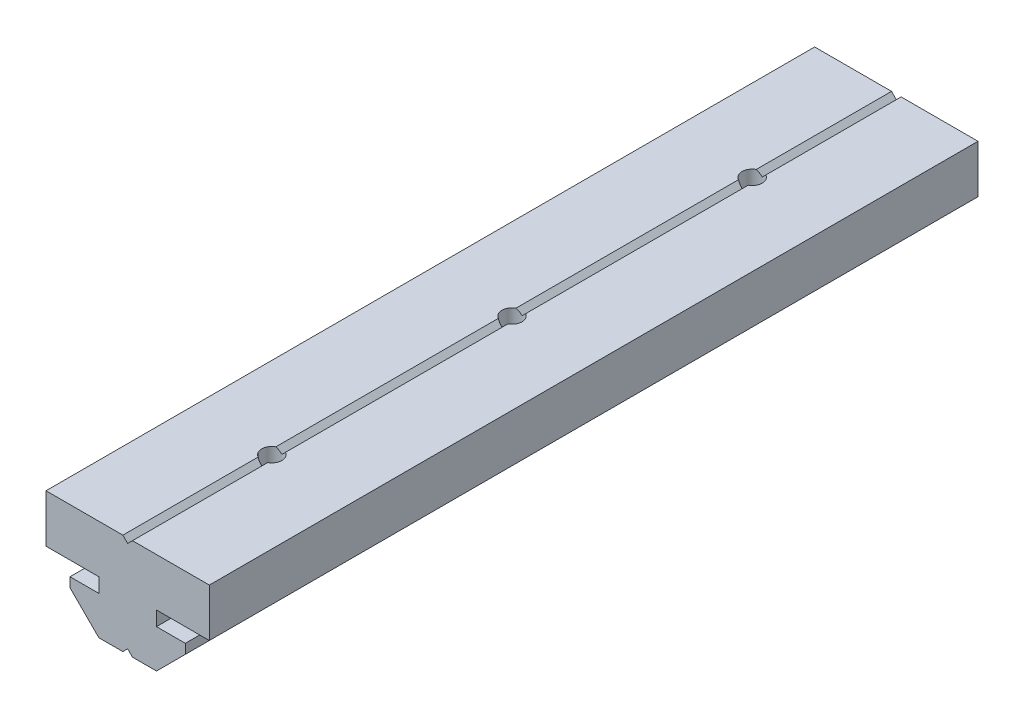
ISO-10303-21;
HEADER;
FILE_DESCRIPTION(('STEP AP214'),'2;1');
FILE_NAME('part.step','',(''),(''),'','','');
FILE_SCHEMA(('AUTOMOTIVE_DESIGN { 1 0 10303 214 1 1 1 1 }'));
ENDSEC;
DATA;
#1=APPLICATION_CONTEXT('core data for automotive mechanical design processes');
#2=APPLICATION_PROTOCOL_DEFINITION('international standard','automotive_design',2000,#1);
#3=PRODUCT_CONTEXT('',#1,'mechanical');
#4=PRODUCT('Part','Part','',(#3));
#5=PRODUCT_RELATED_PRODUCT_CATEGORY('part','',(#4));
#6=PRODUCT_DEFINITION_FORMATION('','',#4);
#7=PRODUCT_DEFINITION_CONTEXT('part definition',#1,'design');
#8=PRODUCT_DEFINITION('design','',#6,#7);
#9=PRODUCT_DEFINITION_SHAPE('','',#8);
#10=(LENGTH_UNIT() NAMED_UNIT(*) SI_UNIT(.MILLI.,.METRE.));
#11=(NAMED_UNIT(*) PLANE_ANGLE_UNIT() SI_UNIT($,.RADIAN.));
#12=(NAMED_UNIT(*) SI_UNIT($,.STERADIAN.) SOLID_ANGLE_UNIT());
#13=UNCERTAINTY_MEASURE_WITH_UNIT(LENGTH_MEASURE(1.E-05),#10,'distance_accuracy_value','');
#14=(GEOMETRIC_REPRESENTATION_CONTEXT(3) GLOBAL_UNCERTAINTY_ASSIGNED_CONTEXT((#13)) GLOBAL_UNIT_ASSIGNED_CONTEXT((#10,
#11,#12)) REPRESENTATION_CONTEXT('',''));
#15=CARTESIAN_POINT('',(0.,0.,0.));
#16=DIRECTION('',(0.,0.,1.));
#17=DIRECTION('',(1.,0.,0.));
#18=AXIS2_PLACEMENT_3D('',#15,#16,#17);
#19=CARTESIAN_POINT('',(-0.500000000000002,0.,80.));
#20=DIRECTION('',(-0.707106781186546,0.707106781186549,0.));
#21=DIRECTION('',(-0.707106781186549,-0.707106781186546,0.));
#22=AXIS2_PLACEMENT_3D('',#19,#20,#21);
#23=PLANE('',#22);
#24=DIRECTION('',(0.,0.,-1.));
#25=VECTOR('',#24,1.);
#26=CARTESIAN_POINT('',(0.,0.5,80.));
#27=LINE('',#26,#25);
#28=CARTESIAN_POINT('',(0.,0.5,13.95));
#29=VERTEX_POINT('',#28);
#30=CARTESIAN_POINT('',(0.,0.5,0.));
#31=VERTEX_POINT('',#30);
#32=EDGE_CURVE('E307',#29,#31,#27,.T.);
#33=ORIENTED_EDGE('',*,*,#32,.F.);
#34=CARTESIAN_POINT('',(0.,0.500000000000002,15.));
#35=DIRECTION('',(-0.707106781186546,0.707106781186549,0.));
#36=DIRECTION('',(0.707106781186549,0.707106781186546,0.));
#37=AXIS2_PLACEMENT_3D('',#34,#35,#36);
#38=ELLIPSE('',#37,1.48492424049175,1.05);
#39=CARTESIAN_POINT('',(-0.500000000000003,0.,14.076690734369));
#40=VERTEX_POINT('',#39);
#41=EDGE_CURVE('E293',#29,#40,#38,.T.);
#42=ORIENTED_EDGE('',*,*,#41,.T.);
#43=DIRECTION('',(0.,0.,-1.));
#44=VECTOR('',#43,1.);
#45=CARTESIAN_POINT('',(-0.500000000000002,0.,80.));
#46=LINE('',#45,#44);
#47=CARTESIAN_POINT('',(-0.500000000000002,0.,0.));
#48=VERTEX_POINT('',#47);
#49=EDGE_CURVE('E312',#40,#48,#46,.T.);
#50=ORIENTED_EDGE('',*,*,#49,.T.);
#51=DIRECTION('',(0.707106781186549,0.707106781186546,0.));
#52=VECTOR('',#51,1.);
#53=CARTESIAN_POINT('',(-0.500000000000002,0.,0.));
#54=LINE('',#53,#52);
#55=EDGE_CURVE('E487',#48,#31,#54,.T.);
#56=ORIENTED_EDGE('',*,*,#55,.T.);
#57=EDGE_LOOP('',(#33,#42,#50,#56));
#58=FACE_BOUND('',#57,.T.);
#59=ADVANCED_FACE('F32',(#58),#23,.F.);
#60=CARTESIAN_POINT('',(0.,10.,80.));
#61=DIRECTION('',(-0.707106781186549,-0.707106781186546,0.));
#62=DIRECTION('',(0.707106781186546,-0.707106781186549,0.));
#63=AXIS2_PLACEMENT_3D('',#60,#61,#62);
#64=PLANE('',#63);
#65=DIRECTION('',(0.,0.,-1.));
#66=VECTOR('',#65,1.);
#67=CARTESIAN_POINT('',(-0.499999999999999,10.5,80.));
#68=LINE('',#67,#66);
#69=CARTESIAN_POINT('',(-0.499999999999999,10.5,14.076690734369));
#70=VERTEX_POINT('',#69);
#71=CARTESIAN_POINT('',(-0.499999999999999,10.5,0.));
#72=VERTEX_POINT('',#71);
#73=EDGE_CURVE('E339',#70,#72,#68,.T.);
#74=ORIENTED_EDGE('',*,*,#73,.F.);
#75=CARTESIAN_POINT('',(0.,10.,15.));
#76=DIRECTION('',(-0.707106781186549,-0.707106781186546,0.));
#77=DIRECTION('',(-0.707106781186546,0.707106781186549,0.));
#78=AXIS2_PLACEMENT_3D('',#75,#76,#77);
#79=ELLIPSE('',#78,1.48492424049176,1.05);
#80=CARTESIAN_POINT('',(0.,10.,13.95));
#81=VERTEX_POINT('',#80);
#82=EDGE_CURVE('E55',#70,#81,#79,.T.);
#83=ORIENTED_EDGE('',*,*,#82,.T.);
#84=DIRECTION('',(0.,0.,-1.));
#85=VECTOR('',#84,1.);
#86=CARTESIAN_POINT('',(0.,10.,80.));
#87=LINE('',#86,#85);
#88=CARTESIAN_POINT('',(0.,10.,0.));
#89=VERTEX_POINT('',#88);
#90=EDGE_CURVE('E346',#81,#89,#87,.T.);
#91=ORIENTED_EDGE('',*,*,#90,.T.);
#92=DIRECTION('',(-0.707106781186546,0.707106781186549,0.));
#93=VECTOR('',#92,1.);
#94=CARTESIAN_POINT('',(0.,10.,0.));
#95=LINE('',#94,#93);
#96=EDGE_CURVE('E414',#89,#72,#95,.T.);
#97=ORIENTED_EDGE('',*,*,#96,.T.);
#98=EDGE_LOOP('',(#74,#83,#91,#97));
#99=FACE_BOUND('',#98,.T.);
#100=ADVANCED_FACE('F673',(#99),#64,.F.);
#101=CARTESIAN_POINT('',(0.500000000000002,0.,80.));
#102=DIRECTION('',(0.707106781186546,0.707106781186549,0.));
#103=DIRECTION('',(-0.707106781186549,0.707106781186546,0.));
#104=AXIS2_PLACEMENT_3D('',#101,#102,#103);
#105=PLANE('',#104);
#106=CARTESIAN_POINT('',(0.,0.5,38.95));
#107=VERTEX_POINT('',#106);
#108=CARTESIAN_POINT('',(0.,0.5,16.05));
#109=VERTEX_POINT('',#108);
#110=EDGE_CURVE('E291',#107,#109,#27,.T.);
#111=ORIENTED_EDGE('',*,*,#110,.T.);
#112=CARTESIAN_POINT('',(0.,0.499999999999997,15.));
#113=DIRECTION('',(0.707106781186546,0.707106781186549,0.));
#114=DIRECTION('',(-0.707106781186549,0.707106781186546,0.));
#115=AXIS2_PLACEMENT_3D('',#112,#113,#114);
#116=ELLIPSE('',#115,1.48492424049175,1.05);
#117=CARTESIAN_POINT('',(0.500000000000002,0.,15.923309265631));
#118=VERTEX_POINT('',#117);
#119=EDGE_CURVE('E276',#109,#118,#116,.T.);
#120=ORIENTED_EDGE('',*,*,#119,.T.);
#121=DIRECTION('',(0.,0.,-1.));
#122=VECTOR('',#121,1.);
#123=CARTESIAN_POINT('',(0.500000000000002,0.,80.));
#124=LINE('',#123,#122);
#125=CARTESIAN_POINT('',(0.500000000000002,0.,39.076690734369));
#126=VERTEX_POINT('',#125);
#127=EDGE_CURVE('E289',#126,#118,#124,.T.);
#128=ORIENTED_EDGE('',*,*,#127,.F.);
#129=CARTESIAN_POINT('',(0.,0.499999999999993,40.));
#130=DIRECTION('',(0.707106781186546,0.707106781186549,0.));
#131=DIRECTION('',(-0.707106781186549,0.707106781186546,0.));
#132=AXIS2_PLACEMENT_3D('',#129,#130,#131);
#133=ELLIPSE('',#132,1.48492424049175,1.05);
#134=EDGE_CURVE('E631',#126,#107,#133,.T.);
#135=ORIENTED_EDGE('',*,*,#134,.T.);
#136=EDGE_LOOP('',(#111,#120,#128,#135));
#137=FACE_BOUND('',#136,.T.);
#138=ADVANCED_FACE('F287',(#137),#105,.F.);
#139=CARTESIAN_POINT('',(0.,10.,80.));
#140=DIRECTION('',(0.707106781186549,-0.707106781186546,0.));
#141=DIRECTION('',(0.707106781186546,0.707106781186549,0.));
#142=AXIS2_PLACEMENT_3D('',#139,#140,#141);
#143=PLANE('',#142);
#144=DIRECTION('',(0.,0.,-1.));
#145=VECTOR('',#144,1.);
#146=CARTESIAN_POINT('',(0.499999999999999,10.5,80.));
#147=LINE('',#146,#145);
#148=CARTESIAN_POINT('',(0.499999999999999,10.5,39.076690734369));
#149=VERTEX_POINT('',#148);
#150=CARTESIAN_POINT('',(0.499999999999999,10.5,15.923309265631));
#151=VERTEX_POINT('',#150);
#152=EDGE_CURVE('E719',#149,#151,#147,.T.);
#153=ORIENTED_EDGE('',*,*,#152,.T.);
#154=CARTESIAN_POINT('',(0.,10.,15.));
#155=DIRECTION('',(0.707106781186549,-0.707106781186546,0.));
#156=DIRECTION('',(0.707106781186546,0.707106781186549,0.));
#157=AXIS2_PLACEMENT_3D('',#154,#155,#156);
#158=ELLIPSE('',#157,1.48492424049176,1.05);
#159=CARTESIAN_POINT('',(0.,10.,16.05));
#160=VERTEX_POINT('',#159);
#161=EDGE_CURVE('E646',#151,#160,#158,.T.);
#162=ORIENTED_EDGE('',*,*,#161,.T.);
#163=CARTESIAN_POINT('',(0.,10.,38.95));
#164=VERTEX_POINT('',#163);
#165=EDGE_CURVE('E715',#164,#160,#87,.T.);
#166=ORIENTED_EDGE('',*,*,#165,.F.);
#167=CARTESIAN_POINT('',(0.,10.,40.));
#168=DIRECTION('',(0.707106781186549,-0.707106781186546,0.));
#169=DIRECTION('',(0.707106781186546,0.707106781186549,0.));
#170=AXIS2_PLACEMENT_3D('',#167,#168,#169);
#171=ELLIPSE('',#170,1.48492424049176,1.05);
#172=EDGE_CURVE('E636',#164,#149,#171,.T.);
#173=ORIENTED_EDGE('',*,*,#172,.T.);
#174=EDGE_LOOP('',(#153,#162,#166,#173));
#175=FACE_BOUND('',#174,.T.);
#176=ADVANCED_FACE('F681',(#175),#143,.F.);
#177=CARTESIAN_POINT('',(-0.500000000000003,0.,39.076690734369));
#178=VERTEX_POINT('',#177);
#179=CARTESIAN_POINT('',(-0.500000000000003,0.,15.923309265631));
#180=VERTEX_POINT('',#179);
#181=EDGE_CURVE('E654',#178,#180,#46,.T.);
#182=ORIENTED_EDGE('',*,*,#181,.T.);
#183=EDGE_CURVE('E292',#180,#109,#38,.T.);
#184=ORIENTED_EDGE('',*,*,#183,.T.);
#185=ORIENTED_EDGE('',*,*,#110,.F.);
#186=CARTESIAN_POINT('',(0.,0.500000000000007,40.));
#187=DIRECTION('',(-0.707106781186546,0.707106781186549,0.));
#188=DIRECTION('',(0.707106781186549,0.707106781186546,0.));
#189=AXIS2_PLACEMENT_3D('',#186,#187,#188);
#190=ELLIPSE('',#189,1.48492424049175,1.05);
#191=EDGE_CURVE('E628',#107,#178,#190,.T.);
#192=ORIENTED_EDGE('',*,*,#191,.T.);
#193=EDGE_LOOP('',(#182,#184,#185,#192));
#194=FACE_BOUND('',#193,.T.);
#195=ADVANCED_FACE('F656',(#194),#23,.F.);
#196=ORIENTED_EDGE('',*,*,#165,.T.);
#197=CARTESIAN_POINT('',(-0.499999999999998,10.5,15.923309265631));
#198=VERTEX_POINT('',#197);
#199=EDGE_CURVE('E338',#160,#198,#79,.T.);
#200=ORIENTED_EDGE('',*,*,#199,.T.);
#201=CARTESIAN_POINT('',(-0.499999999999999,10.5,39.076690734369));
#202=VERTEX_POINT('',#201);
#203=EDGE_CURVE('E326',#202,#198,#68,.T.);
#204=ORIENTED_EDGE('',*,*,#203,.F.);
#205=CARTESIAN_POINT('',(0.,9.99999999999999,40.));
#206=DIRECTION('',(-0.707106781186549,-0.707106781186546,0.));
#207=DIRECTION('',(-0.707106781186546,0.707106781186549,0.));
#208=AXIS2_PLACEMENT_3D('',#205,#206,#207);
#209=ELLIPSE('',#208,1.48492424049176,1.05);
#210=EDGE_CURVE('E336',#202,#164,#209,.T.);
#211=ORIENTED_EDGE('',*,*,#210,.T.);
#212=EDGE_LOOP('',(#196,#200,#204,#211));
#213=FACE_BOUND('',#212,.T.);
#214=ADVANCED_FACE('F335',(#213),#64,.F.);
#215=CARTESIAN_POINT('',(0.,0.5,63.95));
#216=VERTEX_POINT('',#215);
#217=CARTESIAN_POINT('',(0.,0.5,41.05));
#218=VERTEX_POINT('',#217);
#219=EDGE_CURVE('E313',#216,#218,#27,.T.);
#220=ORIENTED_EDGE('',*,*,#219,.T.);
#221=CARTESIAN_POINT('',(0.500000000000003,0.,40.923309265631));
#222=VERTEX_POINT('',#221);
#223=EDGE_CURVE('E626',#218,#222,#133,.T.);
#224=ORIENTED_EDGE('',*,*,#223,.T.);
#225=CARTESIAN_POINT('',(0.500000000000002,0.,64.076690734369));
#226=VERTEX_POINT('',#225);
#227=EDGE_CURVE('E299',#226,#222,#124,.T.);
#228=ORIENTED_EDGE('',*,*,#227,.F.);
#229=CARTESIAN_POINT('',(0.,0.49999999999999,65.));
#230=DIRECTION('',(0.707106781186546,0.707106781186549,0.));
#231=DIRECTION('',(-0.707106781186549,0.707106781186546,0.));
#232=AXIS2_PLACEMENT_3D('',#229,#230,#231);
#233=ELLIPSE('',#232,1.48492424049174,1.05);
#234=EDGE_CURVE('E574',#226,#216,#233,.T.);
#235=ORIENTED_EDGE('',*,*,#234,.T.);
#236=EDGE_LOOP('',(#220,#224,#228,#235));
#237=FACE_BOUND('',#236,.T.);
#238=ADVANCED_FACE('F660',(#237),#105,.F.);
#239=CARTESIAN_POINT('',(0.499999999999999,10.5,64.076690734369));
#240=VERTEX_POINT('',#239);
#241=CARTESIAN_POINT('',(0.499999999999999,10.5,40.923309265631));
#242=VERTEX_POINT('',#241);
#243=EDGE_CURVE('E357',#240,#242,#147,.T.);
#244=ORIENTED_EDGE('',*,*,#243,.T.);
#245=CARTESIAN_POINT('',(0.,10.,41.05));
#246=VERTEX_POINT('',#245);
#247=EDGE_CURVE('E635',#242,#246,#171,.T.);
#248=ORIENTED_EDGE('',*,*,#247,.T.);
#249=CARTESIAN_POINT('',(0.,10.,63.95));
#250=VERTEX_POINT('',#249);
#251=EDGE_CURVE('E352',#250,#246,#87,.T.);
#252=ORIENTED_EDGE('',*,*,#251,.F.);
#253=CARTESIAN_POINT('',(0.,10.,65.));
#254=DIRECTION('',(0.707106781186549,-0.707106781186546,0.));
#255=DIRECTION('',(0.707106781186546,0.707106781186549,0.));
#256=AXIS2_PLACEMENT_3D('',#253,#254,#255);
#257=ELLIPSE('',#256,1.48492424049175,1.05);
#258=EDGE_CURVE('E565',#250,#240,#257,.T.);
#259=ORIENTED_EDGE('',*,*,#258,.T.);
#260=EDGE_LOOP('',(#244,#248,#252,#259));
#261=FACE_BOUND('',#260,.T.);
#262=ADVANCED_FACE('F689',(#261),#143,.F.);
#263=CARTESIAN_POINT('',(-0.500000000000002,0.,64.076690734369));
#264=VERTEX_POINT('',#263);
#265=CARTESIAN_POINT('',(-0.500000000000003,0.,40.923309265631));
#266=VERTEX_POINT('',#265);
#267=EDGE_CURVE('E318',#264,#266,#46,.T.);
#268=ORIENTED_EDGE('',*,*,#267,.T.);
#269=EDGE_CURVE('E624',#266,#218,#190,.T.);
#270=ORIENTED_EDGE('',*,*,#269,.T.);
#271=ORIENTED_EDGE('',*,*,#219,.F.);
#272=CARTESIAN_POINT('',(0.,0.50000000000001,65.));
#273=DIRECTION('',(-0.707106781186546,0.707106781186549,0.));
#274=DIRECTION('',(0.707106781186549,0.707106781186546,0.));
#275=AXIS2_PLACEMENT_3D('',#272,#273,#274);
#276=ELLIPSE('',#275,1.48492424049174,1.05);
#277=EDGE_CURVE('E579',#216,#264,#276,.T.);
#278=ORIENTED_EDGE('',*,*,#277,.T.);
#279=EDGE_LOOP('',(#268,#270,#271,#278));
#280=FACE_BOUND('',#279,.T.);
#281=ADVANCED_FACE('F661',(#280),#23,.F.);
#282=CARTESIAN_POINT('',(0.,0.5,80.));
#283=VERTEX_POINT('',#282);
#284=CARTESIAN_POINT('',(0.,0.5,66.05));
#285=VERTEX_POINT('',#284);
#286=EDGE_CURVE('E309',#283,#285,#27,.T.);
#287=ORIENTED_EDGE('',*,*,#286,.T.);
#288=CARTESIAN_POINT('',(0.500000000000001,0.,65.923309265631));
#289=VERTEX_POINT('',#288);
#290=EDGE_CURVE('E581',#285,#289,#233,.T.);
#291=ORIENTED_EDGE('',*,*,#290,.T.);
#292=CARTESIAN_POINT('',(0.500000000000002,0.,80.));
#293=VERTEX_POINT('',#292);
#294=EDGE_CURVE('E302',#293,#289,#124,.T.);
#295=ORIENTED_EDGE('',*,*,#294,.F.);
#296=DIRECTION('',(0.707106781186549,-0.707106781186546,0.));
#297=VECTOR('',#296,1.);
#298=CARTESIAN_POINT('',(0.500000000000002,0.,80.));
#299=LINE('',#298,#297);
#300=EDGE_CURVE('E526',#283,#293,#299,.T.);
#301=ORIENTED_EDGE('',*,*,#300,.F.);
#302=EDGE_LOOP('',(#287,#291,#295,#301));
#303=FACE_BOUND('',#302,.T.);
#304=ADVANCED_FACE('F589',(#303),#105,.F.);
#305=CARTESIAN_POINT('',(0.499999999999999,10.5,80.));
#306=VERTEX_POINT('',#305);
#307=CARTESIAN_POINT('',(0.499999999999999,10.5,65.923309265631));
#308=VERTEX_POINT('',#307);
#309=EDGE_CURVE('E353',#306,#308,#147,.T.);
#310=ORIENTED_EDGE('',*,*,#309,.T.);
#311=CARTESIAN_POINT('',(0.,10.,66.05));
#312=VERTEX_POINT('',#311);
#313=EDGE_CURVE('E560',#308,#312,#257,.T.);
#314=ORIENTED_EDGE('',*,*,#313,.T.);
#315=CARTESIAN_POINT('',(0.,10.,80.));
#316=VERTEX_POINT('',#315);
#317=EDGE_CURVE('E348',#316,#312,#87,.T.);
#318=ORIENTED_EDGE('',*,*,#317,.F.);
#319=DIRECTION('',(-0.707106781186546,-0.707106781186549,0.));
#320=VECTOR('',#319,1.);
#321=CARTESIAN_POINT('',(0.,10.,80.));
#322=LINE('',#321,#320);
#323=EDGE_CURVE('E546',#306,#316,#322,.T.);
#324=ORIENTED_EDGE('',*,*,#323,.F.);
#325=EDGE_LOOP('',(#310,#314,#318,#324));
#326=FACE_BOUND('',#325,.T.);
#327=ADVANCED_FACE('F622',(#326),#143,.F.);
#328=ORIENTED_EDGE('',*,*,#251,.T.);
#329=CARTESIAN_POINT('',(-0.500000000000001,10.5,40.923309265631));
#330=VERTEX_POINT('',#329);
#331=EDGE_CURVE('E633',#246,#330,#209,.T.);
#332=ORIENTED_EDGE('',*,*,#331,.T.);
#333=CARTESIAN_POINT('',(-0.499999999999999,10.5,64.076690734369));
#334=VERTEX_POINT('',#333);
#335=EDGE_CURVE('E328',#334,#330,#68,.T.);
#336=ORIENTED_EDGE('',*,*,#335,.F.);
#337=CARTESIAN_POINT('',(0.,9.99999999999999,65.));
#338=DIRECTION('',(-0.707106781186549,-0.707106781186546,0.));
#339=DIRECTION('',(-0.707106781186546,0.707106781186549,0.));
#340=AXIS2_PLACEMENT_3D('',#337,#338,#339);
#341=ELLIPSE('',#340,1.48492424049175,1.05);
#342=EDGE_CURVE('E563',#334,#250,#341,.T.);
#343=ORIENTED_EDGE('',*,*,#342,.T.);
#344=EDGE_LOOP('',(#328,#332,#336,#343));
#345=FACE_BOUND('',#344,.T.);
#346=ADVANCED_FACE('F687',(#345),#64,.F.);
#347=CARTESIAN_POINT('',(-3.00000000000001,0.,80.));
#348=DIRECTION('',(0.,1.,0.));
#349=DIRECTION('',(-1.,0.,0.));
#350=AXIS2_PLACEMENT_3D('',#347,#348,#349);
#351=PLANE('',#350);
#352=ORIENTED_EDGE('',*,*,#49,.F.);
#353=CARTESIAN_POINT('',(0.,0.,15.));
#354=DIRECTION('',(0.,1.,0.));
#355=DIRECTION('',(0.,0.,1.));
#356=AXIS2_PLACEMENT_3D('',#353,#354,#355);
#357=CIRCLE('',#356,1.05);
#358=EDGE_CURVE('E282',#40,#180,#357,.T.);
#359=ORIENTED_EDGE('',*,*,#358,.T.);
#360=ORIENTED_EDGE('',*,*,#181,.F.);
#361=CARTESIAN_POINT('',(0.,0.,40.));
#362=DIRECTION('',(0.,1.,0.));
#363=DIRECTION('',(0.,0.,1.));
#364=AXIS2_PLACEMENT_3D('',#361,#362,#363);
#365=CIRCLE('',#364,1.05);
#366=EDGE_CURVE('E641',#178,#266,#365,.T.);
#367=ORIENTED_EDGE('',*,*,#366,.T.);
#368=ORIENTED_EDGE('',*,*,#267,.F.);
#369=CARTESIAN_POINT('',(0.,0.,65.));
#370=DIRECTION('',(0.,1.,0.));
#371=DIRECTION('',(0.,0.,1.));
#372=AXIS2_PLACEMENT_3D('',#369,#370,#371);
#373=CIRCLE('',#372,1.05);
#374=CARTESIAN_POINT('',(-0.500000000000002,0.,65.923309265631));
#375=VERTEX_POINT('',#374);
#376=EDGE_CURVE('E521',#264,#375,#373,.T.);
#377=ORIENTED_EDGE('',*,*,#376,.T.);
#378=CARTESIAN_POINT('',(-0.500000000000002,0.,80.));
#379=VERTEX_POINT('',#378);
#380=EDGE_CURVE('E314',#379,#375,#46,.T.);
#381=ORIENTED_EDGE('',*,*,#380,.F.);
#382=DIRECTION('',(1.,0.,0.));
#383=VECTOR('',#382,1.);
#384=CARTESIAN_POINT('',(-3.00000000000001,0.,80.));
#385=LINE('',#384,#383);
#386=CARTESIAN_POINT('',(-3.00000000000001,0.,80.));
#387=VERTEX_POINT('',#386);
#388=EDGE_CURVE('E431',#387,#379,#385,.T.);
#389=ORIENTED_EDGE('',*,*,#388,.F.);
#390=DIRECTION('',(0.,0.,-1.));
#391=VECTOR('',#390,1.);
#392=CARTESIAN_POINT('',(-3.00000000000001,0.,80.));
#393=LINE('',#392,#391);
#394=CARTESIAN_POINT('',(-3.00000000000001,0.,0.));
#395=VERTEX_POINT('',#394);
#396=EDGE_CURVE('E432',#387,#395,#393,.T.);
#397=ORIENTED_EDGE('',*,*,#396,.T.);
#398=DIRECTION('',(1.,0.,0.));
#399=VECTOR('',#398,1.);
#400=CARTESIAN_POINT('',(-3.00000000000001,0.,0.));
#401=LINE('',#400,#399);
#402=EDGE_CURVE('E484',#395,#48,#401,.T.);
#403=ORIENTED_EDGE('',*,*,#402,.T.);
#404=EDGE_LOOP('',(#352,#359,#360,#367,#368,#377,#381,#389,#397,#403));
#405=FACE_BOUND('',#404,.T.);
#406=ADVANCED_FACE('F34',(#405),#351,.F.);
#407=ORIENTED_EDGE('',*,*,#380,.T.);
#408=EDGE_CURVE('E488',#375,#285,#276,.T.);
#409=ORIENTED_EDGE('',*,*,#408,.T.);
#410=ORIENTED_EDGE('',*,*,#286,.F.);
#411=DIRECTION('',(0.707106781186549,0.707106781186546,0.));
#412=VECTOR('',#411,1.);
#413=CARTESIAN_POINT('',(-0.500000000000002,0.,80.));
#414=LINE('',#413,#412);
#415=EDGE_CURVE('E516',#379,#283,#414,.T.);
#416=ORIENTED_EDGE('',*,*,#415,.F.);
#417=EDGE_LOOP('',(#407,#409,#410,#416));
#418=FACE_BOUND('',#417,.T.);
#419=ADVANCED_FACE('F524',(#418),#23,.F.);
#420=CARTESIAN_POINT('',(0.500000000000002,0.,14.076690734369));
#421=VERTEX_POINT('',#420);
#422=CARTESIAN_POINT('',(0.500000000000002,0.,0.));
#423=VERTEX_POINT('',#422);
#424=EDGE_CURVE('E300',#421,#423,#124,.T.);
#425=ORIENTED_EDGE('',*,*,#424,.F.);
#426=EDGE_CURVE('E47',#421,#29,#116,.T.);
#427=ORIENTED_EDGE('',*,*,#426,.T.);
#428=ORIENTED_EDGE('',*,*,#32,.T.);
#429=DIRECTION('',(0.707106781186549,-0.707106781186546,0.));
#430=VECTOR('',#429,1.);
#431=CARTESIAN_POINT('',(0.500000000000002,0.,0.));
#432=LINE('',#431,#430);
#433=EDGE_CURVE('E397',#31,#423,#432,.T.);
#434=ORIENTED_EDGE('',*,*,#433,.T.);
#435=EDGE_LOOP('',(#425,#427,#428,#434));
#436=FACE_BOUND('',#435,.T.);
#437=ADVANCED_FACE('F492',(#436),#105,.F.);
#438=CARTESIAN_POINT('',(3.00000000000001,0.,80.));
#439=DIRECTION('',(0.,1.,0.));
#440=DIRECTION('',(-1.,0.,0.));
#441=AXIS2_PLACEMENT_3D('',#438,#439,#440);
#442=PLANE('',#441);
#443=ORIENTED_EDGE('',*,*,#127,.T.);
#444=EDGE_CURVE('E273',#118,#421,#357,.T.);
#445=ORIENTED_EDGE('',*,*,#444,.T.);
#446=ORIENTED_EDGE('',*,*,#424,.T.);
#447=DIRECTION('',(1.,0.,0.));
#448=VECTOR('',#447,1.);
#449=CARTESIAN_POINT('',(3.00000000000001,0.,0.));
#450=LINE('',#449,#448);
#451=CARTESIAN_POINT('',(3.00000000000001,0.,0.));
#452=VERTEX_POINT('',#451);
#453=EDGE_CURVE('E391',#423,#452,#450,.T.);
#454=ORIENTED_EDGE('',*,*,#453,.T.);
#455=DIRECTION('',(0.,0.,-1.));
#456=VECTOR('',#455,1.);
#457=CARTESIAN_POINT('',(3.00000000000001,0.,80.));
#458=LINE('',#457,#456);
#459=CARTESIAN_POINT('',(3.00000000000001,0.,80.));
#460=VERTEX_POINT('',#459);
#461=EDGE_CURVE('E303',#460,#452,#458,.T.);
#462=ORIENTED_EDGE('',*,*,#461,.F.);
#463=DIRECTION('',(1.,0.,0.));
#464=VECTOR('',#463,1.);
#465=CARTESIAN_POINT('',(3.00000000000001,0.,80.));
#466=LINE('',#465,#464);
#467=EDGE_CURVE('E528',#293,#460,#466,.T.);
#468=ORIENTED_EDGE('',*,*,#467,.F.);
#469=ORIENTED_EDGE('',*,*,#294,.T.);
#470=EDGE_CURVE('E561',#289,#226,#373,.T.);
#471=ORIENTED_EDGE('',*,*,#470,.T.);
#472=ORIENTED_EDGE('',*,*,#227,.T.);
#473=EDGE_CURVE('E298',#222,#126,#365,.T.);
#474=ORIENTED_EDGE('',*,*,#473,.T.);
#475=EDGE_LOOP('',(#443,#445,#446,#454,#462,#468,#469,#471,#472,#474));
#476=FACE_BOUND('',#475,.T.);
#477=ADVANCED_FACE('F296',(#476),#442,.F.);
#478=CARTESIAN_POINT('',(6.,3.,80.));
#479=DIRECTION('',(-0.707106781186549,0.707106781186546,0.));
#480=DIRECTION('',(-0.707106781186546,-0.707106781186549,0.));
#481=AXIS2_PLACEMENT_3D('',#478,#479,#480);
#482=PLANE('',#481);
#483=DIRECTION('',(0.707106781186546,0.707106781186549,0.));
#484=VECTOR('',#483,1.);
#485=CARTESIAN_POINT('',(6.,3.,0.));
#486=LINE('',#485,#484);
#487=CARTESIAN_POINT('',(6.,3.,0.));
#488=VERTEX_POINT('',#487);
#489=EDGE_CURVE('E383',#452,#488,#486,.T.);
#490=ORIENTED_EDGE('',*,*,#489,.T.);
#491=DIRECTION('',(0.,0.,-1.));
#492=VECTOR('',#491,1.);
#493=CARTESIAN_POINT('',(6.,3.,80.));
#494=LINE('',#493,#492);
#495=CARTESIAN_POINT('',(6.,3.,80.));
#496=VERTEX_POINT('',#495);
#497=EDGE_CURVE('E371',#496,#488,#494,.T.);
#498=ORIENTED_EDGE('',*,*,#497,.F.);
#499=DIRECTION('',(0.707106781186546,0.707106781186549,0.));
#500=VECTOR('',#499,1.);
#501=CARTESIAN_POINT('',(6.,3.,80.));
#502=LINE('',#501,#500);
#503=EDGE_CURVE('E384',#460,#496,#502,.T.);
#504=ORIENTED_EDGE('',*,*,#503,.F.);
#505=ORIENTED_EDGE('',*,*,#461,.T.);
#506=EDGE_LOOP('',(#490,#498,#504,#505));
#507=FACE_BOUND('',#506,.T.);
#508=ADVANCED_FACE('F382',(#507),#482,.F.);
#509=CARTESIAN_POINT('',(6.,4.,80.));
#510=DIRECTION('',(-1.,0.,0.));
#511=DIRECTION('',(0.,0.,1.));
#512=AXIS2_PLACEMENT_3D('',#509,#510,#511);
#513=PLANE('',#512);
#514=DIRECTION('',(0.,1.,0.));
#515=VECTOR('',#514,1.);
#516=CARTESIAN_POINT('',(6.,4.,0.));
#517=LINE('',#516,#515);
#518=CARTESIAN_POINT('',(6.,4.,0.));
#519=VERTEX_POINT('',#518);
#520=EDGE_CURVE('E393',#488,#519,#517,.T.);
#521=ORIENTED_EDGE('',*,*,#520,.T.);
#522=DIRECTION('',(0.,0.,-1.));
#523=VECTOR('',#522,1.);
#524=CARTESIAN_POINT('',(6.,4.,80.));
#525=LINE('',#524,#523);
#526=CARTESIAN_POINT('',(6.,4.,80.));
#527=VERTEX_POINT('',#526);
#528=EDGE_CURVE('E369',#527,#519,#525,.T.);
#529=ORIENTED_EDGE('',*,*,#528,.F.);
#530=DIRECTION('',(0.,1.,0.));
#531=VECTOR('',#530,1.);
#532=CARTESIAN_POINT('',(6.,4.,80.));
#533=LINE('',#532,#531);
#534=EDGE_CURVE('E534',#496,#527,#533,.T.);
#535=ORIENTED_EDGE('',*,*,#534,.F.);
#536=ORIENTED_EDGE('',*,*,#497,.T.);
#537=EDGE_LOOP('',(#521,#529,#535,#536));
#538=FACE_BOUND('',#537,.T.);
#539=ADVANCED_FACE('F593',(#538),#513,.F.);
#540=CARTESIAN_POINT('',(3.,4.,80.));
#541=DIRECTION('',(0.,-1.,0.));
#542=DIRECTION('',(0.,0.,-1.));
#543=AXIS2_PLACEMENT_3D('',#540,#541,#542);
#544=PLANE('',#543);
#545=DIRECTION('',(-1.,0.,0.));
#546=VECTOR('',#545,1.);
#547=CARTESIAN_POINT('',(3.,4.,0.));
#548=LINE('',#547,#546);
#549=CARTESIAN_POINT('',(3.,4.,0.));
#550=VERTEX_POINT('',#549);
#551=EDGE_CURVE('E395',#519,#550,#548,.T.);
#552=ORIENTED_EDGE('',*,*,#551,.T.);
#553=DIRECTION('',(0.,0.,-1.));
#554=VECTOR('',#553,1.);
#555=CARTESIAN_POINT('',(3.,4.,80.));
#556=LINE('',#555,#554);
#557=CARTESIAN_POINT('',(3.,4.,80.));
#558=VERTEX_POINT('',#557);
#559=EDGE_CURVE('E366',#558,#550,#556,.T.);
#560=ORIENTED_EDGE('',*,*,#559,.F.);
#561=DIRECTION('',(-1.,0.,0.));
#562=VECTOR('',#561,1.);
#563=CARTESIAN_POINT('',(3.,4.,80.));
#564=LINE('',#563,#562);
#565=EDGE_CURVE('E536',#527,#558,#564,.T.);
#566=ORIENTED_EDGE('',*,*,#565,.F.);
#567=ORIENTED_EDGE('',*,*,#528,.T.);
#568=EDGE_LOOP('',(#552,#560,#566,#567));
#569=FACE_BOUND('',#568,.T.);
#570=ADVANCED_FACE('F597',(#569),#544,.F.);
#571=CARTESIAN_POINT('',(3.,5.5,80.));
#572=DIRECTION('',(-1.,0.,0.));
#573=DIRECTION('',(0.,-1.,0.));
#574=AXIS2_PLACEMENT_3D('',#571,#572,#573);
#575=PLANE('',#574);
#576=DIRECTION('',(0.,1.,0.));
#577=VECTOR('',#576,1.);
#578=CARTESIAN_POINT('',(3.,5.5,0.));
#579=LINE('',#578,#577);
#580=CARTESIAN_POINT('',(3.,5.5,0.));
#581=VERTEX_POINT('',#580);
#582=EDGE_CURVE('E402',#550,#581,#579,.T.);
#583=ORIENTED_EDGE('',*,*,#582,.T.);
#584=DIRECTION('',(0.,0.,-1.));
#585=VECTOR('',#584,1.);
#586=CARTESIAN_POINT('',(3.,5.5,80.));
#587=LINE('',#586,#585);
#588=CARTESIAN_POINT('',(3.,5.5,80.));
#589=VERTEX_POINT('',#588);
#590=EDGE_CURVE('E363',#589,#581,#587,.T.);
#591=ORIENTED_EDGE('',*,*,#590,.F.);
#592=DIRECTION('',(0.,1.,0.));
#593=VECTOR('',#592,1.);
#594=CARTESIAN_POINT('',(3.,5.5,80.));
#595=LINE('',#594,#593);
#596=EDGE_CURVE('E538',#558,#589,#595,.T.);
#597=ORIENTED_EDGE('',*,*,#596,.F.);
#598=ORIENTED_EDGE('',*,*,#559,.T.);
#599=EDGE_LOOP('',(#583,#591,#597,#598));
#600=FACE_BOUND('',#599,.T.);
#601=ADVANCED_FACE('F603',(#600),#575,.F.);
#602=CARTESIAN_POINT('',(8.5,5.5,80.));
#603=DIRECTION('',(0.,1.,0.));
#604=DIRECTION('',(-1.,0.,0.));
#605=AXIS2_PLACEMENT_3D('',#602,#603,#604);
#606=PLANE('',#605);
#607=DIRECTION('',(1.,0.,0.));
#608=VECTOR('',#607,1.);
#609=CARTESIAN_POINT('',(8.5,5.5,0.));
#610=LINE('',#609,#608);
#611=CARTESIAN_POINT('',(8.5,5.5,0.));
#612=VERTEX_POINT('',#611);
#613=EDGE_CURVE('E404',#581,#612,#610,.T.);
#614=ORIENTED_EDGE('',*,*,#613,.T.);
#615=DIRECTION('',(0.,0.,-1.));
#616=VECTOR('',#615,1.);
#617=CARTESIAN_POINT('',(8.5,5.5,80.));
#618=LINE('',#617,#616);
#619=CARTESIAN_POINT('',(8.5,5.5,80.));
#620=VERTEX_POINT('',#619);
#621=EDGE_CURVE('E360',#620,#612,#618,.T.);
#622=ORIENTED_EDGE('',*,*,#621,.F.);
#623=DIRECTION('',(1.,0.,0.));
#624=VECTOR('',#623,1.);
#625=CARTESIAN_POINT('',(8.5,5.5,80.));
#626=LINE('',#625,#624);
#627=EDGE_CURVE('E540',#589,#620,#626,.T.);
#628=ORIENTED_EDGE('',*,*,#627,.F.);
#629=ORIENTED_EDGE('',*,*,#590,.T.);
#630=EDGE_LOOP('',(#614,#622,#628,#629));
#631=FACE_BOUND('',#630,.T.);
#632=ADVANCED_FACE('F607',(#631),#606,.F.);
#633=CARTESIAN_POINT('',(8.5,10.5,80.));
#634=DIRECTION('',(-1.,0.,0.));
#635=DIRECTION('',(0.,0.,1.));
#636=AXIS2_PLACEMENT_3D('',#633,#634,#635);
#637=PLANE('',#636);
#638=DIRECTION('',(0.,1.,0.));
#639=VECTOR('',#638,1.);
#640=CARTESIAN_POINT('',(8.5,10.5,0.));
#641=LINE('',#640,#639);
#642=CARTESIAN_POINT('',(8.5,10.5,0.));
#643=VERTEX_POINT('',#642);
#644=EDGE_CURVE('E406',#612,#643,#641,.T.);
#645=ORIENTED_EDGE('',*,*,#644,.T.);
#646=DIRECTION('',(0.,0.,-1.));
#647=VECTOR('',#646,1.);
#648=CARTESIAN_POINT('',(8.5,10.5,80.));
#649=LINE('',#648,#647);
#650=CARTESIAN_POINT('',(8.5,10.5,80.));
#651=VERTEX_POINT('',#650);
#652=EDGE_CURVE('E356',#651,#643,#649,.T.);
#653=ORIENTED_EDGE('',*,*,#652,.F.);
#654=DIRECTION('',(0.,1.,0.));
#655=VECTOR('',#654,1.);
#656=CARTESIAN_POINT('',(8.5,10.5,80.));
#657=LINE('',#656,#655);
#658=EDGE_CURVE('E542',#620,#651,#657,.T.);
#659=ORIENTED_EDGE('',*,*,#658,.F.);
#660=ORIENTED_EDGE('',*,*,#621,.T.);
#661=EDGE_LOOP('',(#645,#653,#659,#660));
#662=FACE_BOUND('',#661,.T.);
#663=ADVANCED_FACE('F612',(#662),#637,.F.);
#664=CARTESIAN_POINT('',(0.499999999999999,10.5,80.));
#665=DIRECTION('',(0.,-1.,0.));
#666=DIRECTION('',(1.,0.,0.));
#667=AXIS2_PLACEMENT_3D('',#664,#665,#666);
#668=PLANE('',#667);
#669=CARTESIAN_POINT('',(0.499999999999999,10.5,14.076690734369));
#670=VERTEX_POINT('',#669);
#671=CARTESIAN_POINT('',(0.499999999999999,10.5,0.));
#672=VERTEX_POINT('',#671);
#673=EDGE_CURVE('E351',#670,#672,#147,.T.);
#674=ORIENTED_EDGE('',*,*,#673,.F.);
#675=CARTESIAN_POINT('',(0.,10.5,15.));
#676=DIRECTION('',(0.,1.,0.));
#677=DIRECTION('',(0.,0.,1.));
#678=AXIS2_PLACEMENT_3D('',#675,#676,#677);
#679=CIRCLE('',#678,1.05);
#680=EDGE_CURVE('E649',#151,#670,#679,.T.);
#681=ORIENTED_EDGE('',*,*,#680,.F.);
#682=ORIENTED_EDGE('',*,*,#152,.F.);
#683=CARTESIAN_POINT('',(0.,10.5,40.));
#684=DIRECTION('',(0.,1.,0.));
#685=DIRECTION('',(0.,0.,1.));
#686=AXIS2_PLACEMENT_3D('',#683,#684,#685);
#687=CIRCLE('',#686,1.05);
#688=EDGE_CURVE('E639',#242,#149,#687,.T.);
#689=ORIENTED_EDGE('',*,*,#688,.F.);
#690=ORIENTED_EDGE('',*,*,#243,.F.);
#691=CARTESIAN_POINT('',(0.,10.5,65.));
#692=DIRECTION('',(0.,1.,0.));
#693=DIRECTION('',(0.,0.,1.));
#694=AXIS2_PLACEMENT_3D('',#691,#692,#693);
#695=CIRCLE('',#694,1.05);
#696=EDGE_CURVE('E620',#308,#240,#695,.T.);
#697=ORIENTED_EDGE('',*,*,#696,.F.);
#698=ORIENTED_EDGE('',*,*,#309,.F.);
#699=DIRECTION('',(-1.,0.,0.));
#700=VECTOR('',#699,1.);
#701=CARTESIAN_POINT('',(0.499999999999999,10.5,80.));
#702=LINE('',#701,#700);
#703=EDGE_CURVE('E544',#651,#306,#702,.T.);
#704=ORIENTED_EDGE('',*,*,#703,.F.);
#705=ORIENTED_EDGE('',*,*,#652,.T.);
#706=DIRECTION('',(-1.,0.,0.));
#707=VECTOR('',#706,1.);
#708=CARTESIAN_POINT('',(0.499999999999999,10.5,0.));
#709=LINE('',#708,#707);
#710=EDGE_CURVE('E408',#643,#672,#709,.T.);
#711=ORIENTED_EDGE('',*,*,#710,.T.);
#712=EDGE_LOOP('',(#674,#681,#682,#689,#690,#697,#698,#704,#705,#711));
#713=FACE_BOUND('',#712,.T.);
#714=ADVANCED_FACE('F619',(#713),#668,.F.);
#715=ORIENTED_EDGE('',*,*,#90,.F.);
#716=EDGE_CURVE('E281',#81,#670,#158,.T.);
#717=ORIENTED_EDGE('',*,*,#716,.T.);
#718=ORIENTED_EDGE('',*,*,#673,.T.);
#719=DIRECTION('',(-0.707106781186546,-0.707106781186549,0.));
#720=VECTOR('',#719,1.);
#721=CARTESIAN_POINT('',(0.,10.,0.));
#722=LINE('',#721,#720);
#723=EDGE_CURVE('E411',#672,#89,#722,.T.);
#724=ORIENTED_EDGE('',*,*,#723,.T.);
#725=EDGE_LOOP('',(#715,#717,#718,#724));
#726=FACE_BOUND('',#725,.T.);
#727=ADVANCED_FACE('F698',(#726),#143,.F.);
#728=ORIENTED_EDGE('',*,*,#317,.T.);
#729=CARTESIAN_POINT('',(-0.500000000000001,10.5,65.923309265631));
#730=VERTEX_POINT('',#729);
#731=EDGE_CURVE('E556',#312,#730,#341,.T.);
#732=ORIENTED_EDGE('',*,*,#731,.T.);
#733=CARTESIAN_POINT('',(-0.499999999999999,10.5,80.));
#734=VERTEX_POINT('',#733);
#735=EDGE_CURVE('E341',#734,#730,#68,.T.);
#736=ORIENTED_EDGE('',*,*,#735,.F.);
#737=DIRECTION('',(-0.707106781186546,0.707106781186549,0.));
#738=VECTOR('',#737,1.);
#739=CARTESIAN_POINT('',(0.,10.,80.));
#740=LINE('',#739,#738);
#741=EDGE_CURVE('E548',#316,#734,#740,.T.);
#742=ORIENTED_EDGE('',*,*,#741,.F.);
#743=EDGE_LOOP('',(#728,#732,#736,#742));
#744=FACE_BOUND('',#743,.T.);
#745=ADVANCED_FACE('F555',(#744),#64,.F.);
#746=CARTESIAN_POINT('',(-0.499999999999999,10.5,80.));
#747=DIRECTION('',(0.,-1.,0.));
#748=DIRECTION('',(1.,0.,0.));
#749=AXIS2_PLACEMENT_3D('',#746,#747,#748);
#750=PLANE('',#749);
#751=ORIENTED_EDGE('',*,*,#203,.T.);
#752=CARTESIAN_POINT('',(0.,10.5,15.));
#753=DIRECTION('',(0.,-1.,0.));
#754=DIRECTION('',(1.,0.,0.));
#755=AXIS2_PLACEMENT_3D('',#752,#753,#754);
#756=CIRCLE('',#755,1.05);
#757=EDGE_CURVE('E11',#198,#70,#756,.T.);
#758=ORIENTED_EDGE('',*,*,#757,.T.);
#759=ORIENTED_EDGE('',*,*,#73,.T.);
#760=DIRECTION('',(-1.,0.,0.));
#761=VECTOR('',#760,1.);
#762=CARTESIAN_POINT('',(-0.499999999999999,10.5,0.));
#763=LINE('',#762,#761);
#764=CARTESIAN_POINT('',(-8.5,10.5,0.));
#765=VERTEX_POINT('',#764);
#766=EDGE_CURVE('E417',#72,#765,#763,.T.);
#767=ORIENTED_EDGE('',*,*,#766,.T.);
#768=DIRECTION('',(0.,0.,-1.));
#769=VECTOR('',#768,1.);
#770=CARTESIAN_POINT('',(-8.5,10.5,80.));
#771=LINE('',#770,#769);
#772=CARTESIAN_POINT('',(-8.5,10.5,80.));
#773=VERTEX_POINT('',#772);
#774=EDGE_CURVE('E342',#773,#765,#771,.T.);
#775=ORIENTED_EDGE('',*,*,#774,.F.);
#776=DIRECTION('',(-1.,0.,0.));
#777=VECTOR('',#776,1.);
#778=CARTESIAN_POINT('',(-0.499999999999999,10.5,80.));
#779=LINE('',#778,#777);
#780=EDGE_CURVE('E550',#734,#773,#779,.T.);
#781=ORIENTED_EDGE('',*,*,#780,.F.);
#782=ORIENTED_EDGE('',*,*,#735,.T.);
#783=CARTESIAN_POINT('',(0.,10.5,65.));
#784=DIRECTION('',(0.,-1.,0.));
#785=DIRECTION('',(1.,0.,0.));
#786=AXIS2_PLACEMENT_3D('',#783,#784,#785);
#787=CIRCLE('',#786,1.05);
#788=EDGE_CURVE('E317',#730,#334,#787,.T.);
#789=ORIENTED_EDGE('',*,*,#788,.T.);
#790=ORIENTED_EDGE('',*,*,#335,.T.);
#791=CARTESIAN_POINT('',(0.,10.5,40.));
#792=DIRECTION('',(0.,-1.,0.));
#793=DIRECTION('',(1.,0.,0.));
#794=AXIS2_PLACEMENT_3D('',#791,#792,#793);
#795=CIRCLE('',#794,1.05);
#796=EDGE_CURVE('E40',#330,#202,#795,.T.);
#797=ORIENTED_EDGE('',*,*,#796,.T.);
#798=EDGE_LOOP('',(#751,#758,#759,#767,#775,#781,#782,#789,#790,#797));
#799=FACE_BOUND('',#798,.T.);
#800=ADVANCED_FACE('F325',(#799),#750,.F.);
#801=CARTESIAN_POINT('',(-8.5,10.5,80.));
#802=DIRECTION('',(1.,0.,0.));
#803=DIRECTION('',(0.,0.,-1.));
#804=AXIS2_PLACEMENT_3D('',#801,#802,#803);
#805=PLANE('',#804);
#806=DIRECTION('',(0.,-1.,0.));
#807=VECTOR('',#806,1.);
#808=CARTESIAN_POINT('',(-8.5,10.5,0.));
#809=LINE('',#808,#807);
#810=CARTESIAN_POINT('',(-8.5,5.5,0.));
#811=VERTEX_POINT('',#810);
#812=EDGE_CURVE('E419',#765,#811,#809,.T.);
#813=ORIENTED_EDGE('',*,*,#812,.T.);
#814=DIRECTION('',(0.,0.,-1.));
#815=VECTOR('',#814,1.);
#816=CARTESIAN_POINT('',(-8.5,5.5,80.));
#817=LINE('',#816,#815);
#818=CARTESIAN_POINT('',(-8.5,5.5,80.));
#819=VERTEX_POINT('',#818);
#820=EDGE_CURVE('E447',#819,#811,#817,.T.);
#821=ORIENTED_EDGE('',*,*,#820,.F.);
#822=DIRECTION('',(0.,-1.,0.));
#823=VECTOR('',#822,1.);
#824=CARTESIAN_POINT('',(-8.5,10.5,80.));
#825=LINE('',#824,#823);
#826=EDGE_CURVE('E459',#773,#819,#825,.T.);
#827=ORIENTED_EDGE('',*,*,#826,.F.);
#828=ORIENTED_EDGE('',*,*,#774,.T.);
#829=EDGE_LOOP('',(#813,#821,#827,#828));
#830=FACE_BOUND('',#829,.T.);
#831=ADVANCED_FACE('F458',(#830),#805,.F.);
#832=CARTESIAN_POINT('',(-8.5,5.5,80.));
#833=DIRECTION('',(0.,1.,0.));
#834=DIRECTION('',(-1.,0.,0.));
#835=AXIS2_PLACEMENT_3D('',#832,#833,#834);
#836=PLANE('',#835);
#837=DIRECTION('',(1.,0.,0.));
#838=VECTOR('',#837,1.);
#839=CARTESIAN_POINT('',(-8.5,5.5,0.));
#840=LINE('',#839,#838);
#841=CARTESIAN_POINT('',(-3.,5.5,0.));
#842=VERTEX_POINT('',#841);
#843=EDGE_CURVE('E421',#811,#842,#840,.T.);
#844=ORIENTED_EDGE('',*,*,#843,.T.);
#845=DIRECTION('',(0.,0.,-1.));
#846=VECTOR('',#845,1.);
#847=CARTESIAN_POINT('',(-3.,5.5,80.));
#848=LINE('',#847,#846);
#849=CARTESIAN_POINT('',(-3.,5.5,80.));
#850=VERTEX_POINT('',#849);
#851=EDGE_CURVE('E445',#850,#842,#848,.T.);
#852=ORIENTED_EDGE('',*,*,#851,.F.);
#853=DIRECTION('',(1.,0.,0.));
#854=VECTOR('',#853,1.);
#855=CARTESIAN_POINT('',(-8.5,5.5,80.));
#856=LINE('',#855,#854);
#857=EDGE_CURVE('E475',#819,#850,#856,.T.);
#858=ORIENTED_EDGE('',*,*,#857,.F.);
#859=ORIENTED_EDGE('',*,*,#820,.T.);
#860=EDGE_LOOP('',(#844,#852,#858,#859));
#861=FACE_BOUND('',#860,.T.);
#862=ADVANCED_FACE('F466',(#861),#836,.F.);
#863=CARTESIAN_POINT('',(-3.,5.5,80.));
#864=DIRECTION('',(1.,0.,0.));
#865=DIRECTION('',(0.,1.,0.));
#866=AXIS2_PLACEMENT_3D('',#863,#864,#865);
#867=PLANE('',#866);
#868=DIRECTION('',(0.,-1.,0.));
#869=VECTOR('',#868,1.);
#870=CARTESIAN_POINT('',(-3.,5.5,0.));
#871=LINE('',#870,#869);
#872=CARTESIAN_POINT('',(-3.,4.,0.));
#873=VERTEX_POINT('',#872);
#874=EDGE_CURVE('E423',#842,#873,#871,.T.);
#875=ORIENTED_EDGE('',*,*,#874,.T.);
#876=DIRECTION('',(0.,0.,-1.));
#877=VECTOR('',#876,1.);
#878=CARTESIAN_POINT('',(-3.,4.,80.));
#879=LINE('',#878,#877);
#880=CARTESIAN_POINT('',(-3.,4.,80.));
#881=VERTEX_POINT('',#880);
#882=EDGE_CURVE('E442',#881,#873,#879,.T.);
#883=ORIENTED_EDGE('',*,*,#882,.F.);
#884=DIRECTION('',(0.,-1.,0.));
#885=VECTOR('',#884,1.);
#886=CARTESIAN_POINT('',(-3.,5.5,80.));
#887=LINE('',#886,#885);
#888=EDGE_CURVE('E471',#850,#881,#887,.T.);
#889=ORIENTED_EDGE('',*,*,#888,.F.);
#890=ORIENTED_EDGE('',*,*,#851,.T.);
#891=EDGE_LOOP('',(#875,#883,#889,#890));
#892=FACE_BOUND('',#891,.T.);
#893=ADVANCED_FACE('F469',(#892),#867,.F.);
#894=CARTESIAN_POINT('',(-3.,4.,80.));
#895=DIRECTION('',(0.,-1.,0.));
#896=DIRECTION('',(0.,0.,-1.));
#897=AXIS2_PLACEMENT_3D('',#894,#895,#896);
#898=PLANE('',#897);
#899=DIRECTION('',(-1.,0.,0.));
#900=VECTOR('',#899,1.);
#901=CARTESIAN_POINT('',(-3.,4.,0.));
#902=LINE('',#901,#900);
#903=CARTESIAN_POINT('',(-6.,4.,0.));
#904=VERTEX_POINT('',#903);
#905=EDGE_CURVE('E425',#873,#904,#902,.T.);
#906=ORIENTED_EDGE('',*,*,#905,.T.);
#907=DIRECTION('',(0.,0.,-1.));
#908=VECTOR('',#907,1.);
#909=CARTESIAN_POINT('',(-6.,4.,80.));
#910=LINE('',#909,#908);
#911=CARTESIAN_POINT('',(-6.,4.,80.));
#912=VERTEX_POINT('',#911);
#913=EDGE_CURVE('E439',#912,#904,#910,.T.);
#914=ORIENTED_EDGE('',*,*,#913,.F.);
#915=DIRECTION('',(-1.,0.,0.));
#916=VECTOR('',#915,1.);
#917=CARTESIAN_POINT('',(-3.,4.,80.));
#918=LINE('',#917,#916);
#919=EDGE_CURVE('E474',#881,#912,#918,.T.);
#920=ORIENTED_EDGE('',*,*,#919,.F.);
#921=ORIENTED_EDGE('',*,*,#882,.T.);
#922=EDGE_LOOP('',(#906,#914,#920,#921));
#923=FACE_BOUND('',#922,.T.);
#924=ADVANCED_FACE('F514',(#923),#898,.F.);
#925=CARTESIAN_POINT('',(-6.,4.,80.));
#926=DIRECTION('',(1.,0.,0.));
#927=DIRECTION('',(0.,0.,-1.));
#928=AXIS2_PLACEMENT_3D('',#925,#926,#927);
#929=PLANE('',#928);
#930=DIRECTION('',(0.,-1.,0.));
#931=VECTOR('',#930,1.);
#932=CARTESIAN_POINT('',(-6.,4.,0.));
#933=LINE('',#932,#931);
#934=CARTESIAN_POINT('',(-6.,3.,0.));
#935=VERTEX_POINT('',#934);
#936=EDGE_CURVE('E427',#904,#935,#933,.T.);
#937=ORIENTED_EDGE('',*,*,#936,.T.);
#938=DIRECTION('',(0.,0.,-1.));
#939=VECTOR('',#938,1.);
#940=CARTESIAN_POINT('',(-6.,3.,80.));
#941=LINE('',#940,#939);
#942=CARTESIAN_POINT('',(-6.,3.,80.));
#943=VERTEX_POINT('',#942);
#944=EDGE_CURVE('E435',#943,#935,#941,.T.);
#945=ORIENTED_EDGE('',*,*,#944,.F.);
#946=DIRECTION('',(0.,-1.,0.));
#947=VECTOR('',#946,1.);
#948=CARTESIAN_POINT('',(-6.,4.,80.));
#949=LINE('',#948,#947);
#950=EDGE_CURVE('E477',#912,#943,#949,.T.);
#951=ORIENTED_EDGE('',*,*,#950,.F.);
#952=ORIENTED_EDGE('',*,*,#913,.T.);
#953=EDGE_LOOP('',(#937,#945,#951,#952));
#954=FACE_BOUND('',#953,.T.);
#955=ADVANCED_FACE('F510',(#954),#929,.F.);
#956=CARTESIAN_POINT('',(-6.,3.,80.));
#957=DIRECTION('',(0.707106781186549,0.707106781186546,0.));
#958=DIRECTION('',(-0.707106781186546,0.707106781186549,0.));
#959=AXIS2_PLACEMENT_3D('',#956,#957,#958);
#960=PLANE('',#959);
#961=DIRECTION('',(0.707106781186546,-0.707106781186549,0.));
#962=VECTOR('',#961,1.);
#963=CARTESIAN_POINT('',(-6.,3.,0.));
#964=LINE('',#963,#962);
#965=EDGE_CURVE('E429',#935,#395,#964,.T.);
#966=ORIENTED_EDGE('',*,*,#965,.T.);
#967=ORIENTED_EDGE('',*,*,#396,.F.);
#968=DIRECTION('',(0.707106781186546,-0.707106781186549,0.));
#969=VECTOR('',#968,1.);
#970=CARTESIAN_POINT('',(-6.,3.,80.));
#971=LINE('',#970,#969);
#972=EDGE_CURVE('E436',#943,#387,#971,.T.);
#973=ORIENTED_EDGE('',*,*,#972,.F.);
#974=ORIENTED_EDGE('',*,*,#944,.T.);
#975=EDGE_LOOP('',(#966,#967,#973,#974));
#976=FACE_BOUND('',#975,.T.);
#977=ADVANCED_FACE('F506',(#976),#960,.F.);
#978=CARTESIAN_POINT('',(0.,0.,80.));
#979=DIRECTION('',(0.,0.,-1.));
#980=DIRECTION('',(-1.,0.,0.));
#981=AXIS2_PLACEMENT_3D('',#978,#979,#980);
#982=PLANE('',#981);
#983=ORIENTED_EDGE('',*,*,#388,.T.);
#984=ORIENTED_EDGE('',*,*,#415,.T.);
#985=ORIENTED_EDGE('',*,*,#300,.T.);
#986=ORIENTED_EDGE('',*,*,#467,.T.);
#987=ORIENTED_EDGE('',*,*,#503,.T.);
#988=ORIENTED_EDGE('',*,*,#534,.T.);
#989=ORIENTED_EDGE('',*,*,#565,.T.);
#990=ORIENTED_EDGE('',*,*,#596,.T.);
#991=ORIENTED_EDGE('',*,*,#627,.T.);
#992=ORIENTED_EDGE('',*,*,#658,.T.);
#993=ORIENTED_EDGE('',*,*,#703,.T.);
#994=ORIENTED_EDGE('',*,*,#323,.T.);
#995=ORIENTED_EDGE('',*,*,#741,.T.);
#996=ORIENTED_EDGE('',*,*,#780,.T.);
#997=ORIENTED_EDGE('',*,*,#826,.T.);
#998=ORIENTED_EDGE('',*,*,#857,.T.);
#999=ORIENTED_EDGE('',*,*,#888,.T.);
#1000=ORIENTED_EDGE('',*,*,#919,.T.);
#1001=ORIENTED_EDGE('',*,*,#950,.T.);
#1002=ORIENTED_EDGE('',*,*,#972,.T.);
#1003=EDGE_LOOP('',(#983,#984,#985,#986,#987,#988,#989,#990,#991,#992,#993,#994,#995,#996,#997,
#998,#999,#1000,#1001,#1002));
#1004=FACE_BOUND('',#1003,.T.);
#1005=ADVANCED_FACE('F515',(#1004),#982,.F.);
#1006=CARTESIAN_POINT('',(0.,0.,0.));
#1007=DIRECTION('',(0.,0.,-1.));
#1008=DIRECTION('',(-1.,0.,0.));
#1009=AXIS2_PLACEMENT_3D('',#1006,#1007,#1008);
#1010=PLANE('',#1009);
#1011=ORIENTED_EDGE('',*,*,#402,.F.);
#1012=ORIENTED_EDGE('',*,*,#965,.F.);
#1013=ORIENTED_EDGE('',*,*,#936,.F.);
#1014=ORIENTED_EDGE('',*,*,#905,.F.);
#1015=ORIENTED_EDGE('',*,*,#874,.F.);
#1016=ORIENTED_EDGE('',*,*,#843,.F.);
#1017=ORIENTED_EDGE('',*,*,#812,.F.);
#1018=ORIENTED_EDGE('',*,*,#766,.F.);
#1019=ORIENTED_EDGE('',*,*,#96,.F.);
#1020=ORIENTED_EDGE('',*,*,#723,.F.);
#1021=ORIENTED_EDGE('',*,*,#710,.F.);
#1022=ORIENTED_EDGE('',*,*,#644,.F.);
#1023=ORIENTED_EDGE('',*,*,#613,.F.);
#1024=ORIENTED_EDGE('',*,*,#582,.F.);
#1025=ORIENTED_EDGE('',*,*,#551,.F.);
#1026=ORIENTED_EDGE('',*,*,#520,.F.);
#1027=ORIENTED_EDGE('',*,*,#489,.F.);
#1028=ORIENTED_EDGE('',*,*,#453,.F.);
#1029=ORIENTED_EDGE('',*,*,#433,.F.);
#1030=ORIENTED_EDGE('',*,*,#55,.F.);
#1031=EDGE_LOOP('',(#1011,#1012,#1013,#1014,#1015,#1016,#1017,#1018,#1019,#1020,#1021,#1022,
#1023,#1024,#1025,#1026,#1027,#1028,#1029,#1030));
#1032=FACE_BOUND('',#1031,.T.);
#1033=ADVANCED_FACE('F389',(#1032),#1010,.T.);
#1034=CARTESIAN_POINT('',(0.,0.,65.));
#1035=DIRECTION('',(0.,1.,0.));
#1036=DIRECTION('',(0.,0.,1.));
#1037=AXIS2_PLACEMENT_3D('',#1034,#1035,#1036);
#1038=CYLINDRICAL_SURFACE('',#1037,1.05);
#1039=ORIENTED_EDGE('',*,*,#342,.F.);
#1040=ORIENTED_EDGE('',*,*,#788,.F.);
#1041=ORIENTED_EDGE('',*,*,#731,.F.);
#1042=ORIENTED_EDGE('',*,*,#313,.F.);
#1043=ORIENTED_EDGE('',*,*,#696,.T.);
#1044=ORIENTED_EDGE('',*,*,#258,.F.);
#1045=EDGE_LOOP('',(#1039,#1040,#1041,#1042,#1043,#1044));
#1046=FACE_BOUND('',#1045,.T.);
#1047=ORIENTED_EDGE('',*,*,#376,.F.);
#1048=ORIENTED_EDGE('',*,*,#277,.F.);
#1049=ORIENTED_EDGE('',*,*,#234,.F.);
#1050=ORIENTED_EDGE('',*,*,#470,.F.);
#1051=ORIENTED_EDGE('',*,*,#290,.F.);
#1052=ORIENTED_EDGE('',*,*,#408,.F.);
#1053=EDGE_LOOP('',(#1047,#1048,#1049,#1050,#1051,#1052));
#1054=FACE_BOUND('',#1053,.T.);
#1055=ADVANCED_FACE('F623',(#1046,#1054),#1038,.F.);
#1056=CARTESIAN_POINT('',(0.,0.,40.));
#1057=DIRECTION('',(0.,1.,0.));
#1058=DIRECTION('',(0.,0.,1.));
#1059=AXIS2_PLACEMENT_3D('',#1056,#1057,#1058);
#1060=CYLINDRICAL_SURFACE('',#1059,1.05);
#1061=ORIENTED_EDGE('',*,*,#247,.F.);
#1062=ORIENTED_EDGE('',*,*,#688,.T.);
#1063=ORIENTED_EDGE('',*,*,#172,.F.);
#1064=ORIENTED_EDGE('',*,*,#210,.F.);
#1065=ORIENTED_EDGE('',*,*,#796,.F.);
#1066=ORIENTED_EDGE('',*,*,#331,.F.);
#1067=EDGE_LOOP('',(#1061,#1062,#1063,#1064,#1065,#1066));
#1068=FACE_BOUND('',#1067,.T.);
#1069=ORIENTED_EDGE('',*,*,#366,.F.);
#1070=ORIENTED_EDGE('',*,*,#191,.F.);
#1071=ORIENTED_EDGE('',*,*,#134,.F.);
#1072=ORIENTED_EDGE('',*,*,#473,.F.);
#1073=ORIENTED_EDGE('',*,*,#223,.F.);
#1074=ORIENTED_EDGE('',*,*,#269,.F.);
#1075=EDGE_LOOP('',(#1069,#1070,#1071,#1072,#1073,#1074));
#1076=FACE_BOUND('',#1075,.T.);
#1077=ADVANCED_FACE('F663',(#1068,#1076),#1060,.F.);
#1078=CARTESIAN_POINT('',(0.,0.,15.));
#1079=DIRECTION('',(0.,1.,0.));
#1080=DIRECTION('',(0.,0.,1.));
#1081=AXIS2_PLACEMENT_3D('',#1078,#1079,#1080);
#1082=CYLINDRICAL_SURFACE('',#1081,1.05);
#1083=ORIENTED_EDGE('',*,*,#161,.F.);
#1084=ORIENTED_EDGE('',*,*,#680,.T.);
#1085=ORIENTED_EDGE('',*,*,#716,.F.);
#1086=ORIENTED_EDGE('',*,*,#82,.F.);
#1087=ORIENTED_EDGE('',*,*,#757,.F.);
#1088=ORIENTED_EDGE('',*,*,#199,.F.);
#1089=EDGE_LOOP('',(#1083,#1084,#1085,#1086,#1087,#1088));
#1090=FACE_BOUND('',#1089,.T.);
#1091=ORIENTED_EDGE('',*,*,#358,.F.);
#1092=ORIENTED_EDGE('',*,*,#41,.F.);
#1093=ORIENTED_EDGE('',*,*,#426,.F.);
#1094=ORIENTED_EDGE('',*,*,#444,.F.);
#1095=ORIENTED_EDGE('',*,*,#119,.F.);
#1096=ORIENTED_EDGE('',*,*,#183,.F.);
#1097=EDGE_LOOP('',(#1091,#1092,#1093,#1094,#1095,#1096));
#1098=FACE_BOUND('',#1097,.T.);
#1099=ADVANCED_FACE('F275',(#1090,#1098),#1082,.F.);
#1100=CLOSED_SHELL('',(#59,#100,#138,#176,#195,#214,#238,#262,#281,#304,#327,#346,#406,#419,
#437,#477,#508,#539,#570,#601,#632,#663,#714,#727,#745,#800,#831,#862,#893,#924,#955,#977,#1005,
#1033,#1055,#1077,#1099));
#1101=MANIFOLD_SOLID_BREP('B2',#1100);
#1102=ADVANCED_BREP_SHAPE_REPRESENTATION('',(#18,#1101),#14);
#1103=SHAPE_DEFINITION_REPRESENTATION(#9,#1102);
ENDSEC;
END-ISO-10303-21;
